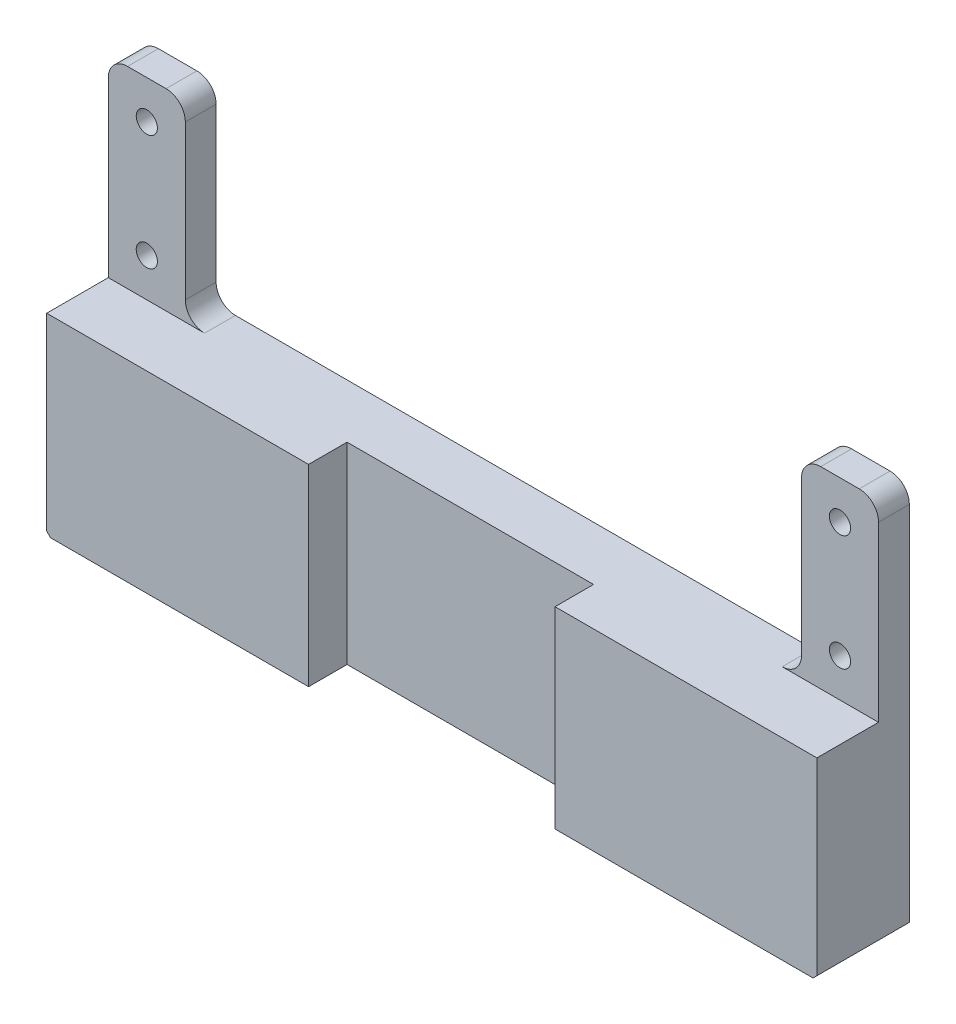
ISO-10303-21;
HEADER;
FILE_DESCRIPTION(('STEP AP214'),'2;1');
FILE_NAME('part.step','',(''),(''),'','','');
FILE_SCHEMA(('AUTOMOTIVE_DESIGN { 1 0 10303 214 1 1 1 1 }'));
ENDSEC;
DATA;
#1=APPLICATION_CONTEXT('core data for automotive mechanical design processes');
#2=APPLICATION_PROTOCOL_DEFINITION('international standard','automotive_design',2000,#1);
#3=PRODUCT_CONTEXT('',#1,'mechanical');
#4=PRODUCT('Part','Part','',(#3));
#5=PRODUCT_RELATED_PRODUCT_CATEGORY('part','',(#4));
#6=PRODUCT_DEFINITION_FORMATION('','',#4);
#7=PRODUCT_DEFINITION_CONTEXT('part definition',#1,'design');
#8=PRODUCT_DEFINITION('design','',#6,#7);
#9=PRODUCT_DEFINITION_SHAPE('','',#8);
#10=(LENGTH_UNIT() NAMED_UNIT(*) SI_UNIT(.MILLI.,.METRE.));
#11=(NAMED_UNIT(*) PLANE_ANGLE_UNIT() SI_UNIT($,.RADIAN.));
#12=(NAMED_UNIT(*) SI_UNIT($,.STERADIAN.) SOLID_ANGLE_UNIT());
#13=UNCERTAINTY_MEASURE_WITH_UNIT(LENGTH_MEASURE(1.E-05),#10,'distance_accuracy_value','');
#14=(GEOMETRIC_REPRESENTATION_CONTEXT(3) GLOBAL_UNCERTAINTY_ASSIGNED_CONTEXT((#13)) GLOBAL_UNIT_ASSIGNED_CONTEXT((#10,
#11,#12)) REPRESENTATION_CONTEXT('',''));
#15=CARTESIAN_POINT('',(0.,0.,0.));
#16=DIRECTION('',(0.,0.,1.));
#17=DIRECTION('',(1.,0.,0.));
#18=AXIS2_PLACEMENT_3D('',#15,#16,#17);
#19=CARTESIAN_POINT('',(0.,0.,0.));
#20=DIRECTION('',(0.,-1.,0.));
#21=DIRECTION('',(0.,0.,-1.));
#22=AXIS2_PLACEMENT_3D('',#19,#20,#21);
#23=PLANE('',#22);
#24=DIRECTION('',(1.,0.,0.));
#25=VECTOR('',#24,1.);
#26=CARTESIAN_POINT('',(100.,0.,0.));
#27=LINE('',#26,#25);
#28=CARTESIAN_POINT('',(75.,0.,0.));
#29=VERTEX_POINT('',#28);
#30=CARTESIAN_POINT('',(100.,0.,0.));
#31=VERTEX_POINT('',#30);
#32=EDGE_CURVE('E441',#29,#31,#27,.T.);
#33=ORIENTED_EDGE('',*,*,#32,.F.);
#34=DIRECTION('',(0.,0.,1.));
#35=VECTOR('',#34,1.);
#36=CARTESIAN_POINT('',(75.,0.,-8.));
#37=LINE('',#36,#35);
#38=CARTESIAN_POINT('',(75.,0.,-8.));
#39=VERTEX_POINT('',#38);
#40=EDGE_CURVE('E292',#29,#39,#37,.F.);
#41=ORIENTED_EDGE('',*,*,#40,.T.);
#42=DIRECTION('',(-1.,0.,0.));
#43=VECTOR('',#42,1.);
#44=CARTESIAN_POINT('',(-100.,0.,-8.));
#45=LINE('',#44,#43);
#46=CARTESIAN_POINT('',(-75.,0.,-8.));
#47=VERTEX_POINT('',#46);
#48=EDGE_CURVE('E197',#39,#47,#45,.T.);
#49=ORIENTED_EDGE('',*,*,#48,.T.);
#50=DIRECTION('',(0.,0.,-1.));
#51=VECTOR('',#50,1.);
#52=CARTESIAN_POINT('',(-75.,0.,0.));
#53=LINE('',#52,#51);
#54=CARTESIAN_POINT('',(-75.,0.,0.));
#55=VERTEX_POINT('',#54);
#56=EDGE_CURVE('E288',#47,#55,#53,.F.);
#57=ORIENTED_EDGE('',*,*,#56,.T.);
#58=DIRECTION('',(1.,0.,0.));
#59=VECTOR('',#58,1.);
#60=CARTESIAN_POINT('',(-100.,0.,0.));
#61=LINE('',#60,#59);
#62=CARTESIAN_POINT('',(-100.,0.,0.));
#63=VERTEX_POINT('',#62);
#64=EDGE_CURVE('E389',#63,#55,#61,.T.);
#65=ORIENTED_EDGE('',*,*,#64,.F.);
#66=DIRECTION('',(0.,0.,1.));
#67=VECTOR('',#66,1.);
#68=CARTESIAN_POINT('',(-100.,0.,16.));
#69=LINE('',#68,#67);
#70=CARTESIAN_POINT('',(-100.,0.,16.));
#71=VERTEX_POINT('',#70);
#72=EDGE_CURVE('E233',#63,#71,#69,.T.);
#73=ORIENTED_EDGE('',*,*,#72,.T.);
#74=DIRECTION('',(1.,0.,0.));
#75=VECTOR('',#74,1.);
#76=CARTESIAN_POINT('',(-32.,0.,16.));
#77=LINE('',#76,#75);
#78=CARTESIAN_POINT('',(-32.,0.,16.));
#79=VERTEX_POINT('',#78);
#80=EDGE_CURVE('E237',#71,#79,#77,.T.);
#81=ORIENTED_EDGE('',*,*,#80,.T.);
#82=DIRECTION('',(0.,0.,-1.));
#83=VECTOR('',#82,1.);
#84=CARTESIAN_POINT('',(-32.,0.,6.00000000000002));
#85=LINE('',#84,#83);
#86=CARTESIAN_POINT('',(-32.,0.,6.00000000000002));
#87=VERTEX_POINT('',#86);
#88=EDGE_CURVE('E203',#79,#87,#85,.T.);
#89=ORIENTED_EDGE('',*,*,#88,.T.);
#90=DIRECTION('',(1.,0.,0.));
#91=VECTOR('',#90,1.);
#92=CARTESIAN_POINT('',(32.,0.,6.00000000000002));
#93=LINE('',#92,#91);
#94=CARTESIAN_POINT('',(32.,0.,6.00000000000002));
#95=VERTEX_POINT('',#94);
#96=EDGE_CURVE('E243',#87,#95,#93,.T.);
#97=ORIENTED_EDGE('',*,*,#96,.T.);
#98=DIRECTION('',(0.,0.,1.));
#99=VECTOR('',#98,1.);
#100=CARTESIAN_POINT('',(32.,0.,16.));
#101=LINE('',#100,#99);
#102=CARTESIAN_POINT('',(32.,0.,16.));
#103=VERTEX_POINT('',#102);
#104=EDGE_CURVE('E247',#95,#103,#101,.T.);
#105=ORIENTED_EDGE('',*,*,#104,.T.);
#106=DIRECTION('',(1.,0.,0.));
#107=VECTOR('',#106,1.);
#108=CARTESIAN_POINT('',(100.,0.,16.));
#109=LINE('',#108,#107);
#110=CARTESIAN_POINT('',(100.,0.,16.));
#111=VERTEX_POINT('',#110);
#112=EDGE_CURVE('E251',#103,#111,#109,.T.);
#113=ORIENTED_EDGE('',*,*,#112,.T.);
#114=DIRECTION('',(0.,0.,-1.));
#115=VECTOR('',#114,1.);
#116=CARTESIAN_POINT('',(100.,0.,-8.));
#117=LINE('',#116,#115);
#118=EDGE_CURVE('E255',#111,#31,#117,.T.);
#119=ORIENTED_EDGE('',*,*,#118,.T.);
#120=EDGE_LOOP('',(#33,#41,#49,#57,#65,#73,#81,#89,#97,#105,#113,#119));
#121=FACE_BOUND('',#120,.T.);
#122=ADVANCED_FACE('F41',(#121),#23,.F.);
#123=CARTESIAN_POINT('',(-100.,-50.,16.));
#124=DIRECTION('',(-1.,0.,0.));
#125=DIRECTION('',(0.,0.,1.));
#126=AXIS2_PLACEMENT_3D('',#123,#124,#125);
#127=PLANE('',#126);
#128=DIRECTION('',(0.,1.,0.));
#129=VECTOR('',#128,1.);
#130=CARTESIAN_POINT('',(-100.,-50.,-8.));
#131=LINE('',#130,#129);
#132=CARTESIAN_POINT('',(-100.,-49.,-8.));
#133=VERTEX_POINT('',#132);
#134=CARTESIAN_POINT('',(-100.,45.,-8.));
#135=VERTEX_POINT('',#134);
#136=EDGE_CURVE('E262',#133,#135,#131,.T.);
#137=ORIENTED_EDGE('',*,*,#136,.F.);
#138=DIRECTION('',(0.,0.,1.));
#139=VECTOR('',#138,1.);
#140=CARTESIAN_POINT('',(-100.,-49.,16.));
#141=LINE('',#140,#139);
#142=CARTESIAN_POINT('',(-100.,-49.,16.));
#143=VERTEX_POINT('',#142);
#144=EDGE_CURVE('E51',#133,#143,#141,.T.);
#145=ORIENTED_EDGE('',*,*,#144,.T.);
#146=DIRECTION('',(0.,1.,0.));
#147=VECTOR('',#146,1.);
#148=CARTESIAN_POINT('',(-100.,-50.,16.));
#149=LINE('',#148,#147);
#150=EDGE_CURVE('E207',#143,#71,#149,.T.);
#151=ORIENTED_EDGE('',*,*,#150,.T.);
#152=ORIENTED_EDGE('',*,*,#72,.F.);
#153=DIRECTION('',(0.,-1.,0.));
#154=VECTOR('',#153,1.);
#155=CARTESIAN_POINT('',(-100.,50.,0.));
#156=LINE('',#155,#154);
#157=CARTESIAN_POINT('',(-100.,45.,0.));
#158=VERTEX_POINT('',#157);
#159=EDGE_CURVE('E238',#158,#63,#156,.T.);
#160=ORIENTED_EDGE('',*,*,#159,.F.);
#161=DIRECTION('',(0.,0.,1.));
#162=VECTOR('',#161,1.);
#163=CARTESIAN_POINT('',(-100.,45.,16.));
#164=LINE('',#163,#162);
#165=EDGE_CURVE('E346',#158,#135,#164,.F.);
#166=ORIENTED_EDGE('',*,*,#165,.T.);
#167=EDGE_LOOP('',(#137,#145,#151,#152,#160,#166));
#168=FACE_BOUND('',#167,.T.);
#169=ADVANCED_FACE('F384',(#168),#127,.T.);
#170=CARTESIAN_POINT('',(-100.,-50.,-8.));
#171=DIRECTION('',(0.,0.,-1.));
#172=DIRECTION('',(-1.,0.,0.));
#173=AXIS2_PLACEMENT_3D('',#170,#171,#172);
#174=PLANE('',#173);
#175=CARTESIAN_POINT('',(90.,40.,-8.));
#176=DIRECTION('',(0.,0.,-1.));
#177=DIRECTION('',(-1.,0.,0.));
#178=AXIS2_PLACEMENT_3D('',#175,#176,#177);
#179=CIRCLE('',#178,2.75);
#180=CARTESIAN_POINT('',(87.25,40.,-8.));
#181=VERTEX_POINT('',#180);
#182=EDGE_CURVE('E499',#181,#181,#179,.T.);
#183=ORIENTED_EDGE('',*,*,#182,.F.);
#184=EDGE_LOOP('',(#183));
#185=FACE_BOUND('',#184,.T.);
#186=CARTESIAN_POINT('',(-90.,10.,-8.));
#187=DIRECTION('',(0.,0.,-1.));
#188=DIRECTION('',(-1.,0.,0.));
#189=AXIS2_PLACEMENT_3D('',#186,#187,#188);
#190=CIRCLE('',#189,2.75);
#191=CARTESIAN_POINT('',(-92.75,10.,-8.));
#192=VERTEX_POINT('',#191);
#193=EDGE_CURVE('E491',#192,#192,#190,.T.);
#194=ORIENTED_EDGE('',*,*,#193,.F.);
#195=EDGE_LOOP('',(#194));
#196=FACE_BOUND('',#195,.T.);
#197=CARTESIAN_POINT('',(90.,10.,-8.));
#198=DIRECTION('',(0.,0.,-1.));
#199=DIRECTION('',(-1.,0.,0.));
#200=AXIS2_PLACEMENT_3D('',#197,#198,#199);
#201=CIRCLE('',#200,2.75);
#202=CARTESIAN_POINT('',(87.25,10.,-8.));
#203=VERTEX_POINT('',#202);
#204=EDGE_CURVE('E483',#203,#203,#201,.T.);
#205=ORIENTED_EDGE('',*,*,#204,.F.);
#206=EDGE_LOOP('',(#205));
#207=FACE_BOUND('',#206,.T.);
#208=CARTESIAN_POINT('',(-90.,40.,-8.));
#209=DIRECTION('',(0.,0.,-1.));
#210=DIRECTION('',(-1.,0.,0.));
#211=AXIS2_PLACEMENT_3D('',#208,#209,#210);
#212=CIRCLE('',#211,2.75);
#213=CARTESIAN_POINT('',(-92.75,40.,-8.));
#214=VERTEX_POINT('',#213);
#215=EDGE_CURVE('E475',#214,#214,#212,.T.);
#216=ORIENTED_EDGE('',*,*,#215,.F.);
#217=EDGE_LOOP('',(#216));
#218=FACE_BOUND('',#217,.T.);
#219=DIRECTION('',(0.,1.,0.));
#220=VECTOR('',#219,1.);
#221=CARTESIAN_POINT('',(100.,-50.,-8.));
#222=LINE('',#221,#220);
#223=CARTESIAN_POINT('',(100.,-49.,-8.));
#224=VERTEX_POINT('',#223);
#225=CARTESIAN_POINT('',(100.,45.,-8.));
#226=VERTEX_POINT('',#225);
#227=EDGE_CURVE('E266',#224,#226,#222,.T.);
#228=ORIENTED_EDGE('',*,*,#227,.F.);
#229=DIRECTION('',(0.707106781186557,0.707106781186538,0.));
#230=VECTOR('',#229,1.);
#231=CARTESIAN_POINT('',(-0.500000000002748,-149.5,-8.));
#232=LINE('',#231,#230);
#233=CARTESIAN_POINT('',(99.,-50.,-8.));
#234=VERTEX_POINT('',#233);
#235=EDGE_CURVE('E370',#224,#234,#232,.F.);
#236=ORIENTED_EDGE('',*,*,#235,.T.);
#237=DIRECTION('',(-1.,0.,0.));
#238=VECTOR('',#237,1.);
#239=CARTESIAN_POINT('',(-100.,-50.,-8.));
#240=LINE('',#239,#238);
#241=CARTESIAN_POINT('',(-99.,-50.,-8.));
#242=VERTEX_POINT('',#241);
#243=EDGE_CURVE('E229',#234,#242,#240,.T.);
#244=ORIENTED_EDGE('',*,*,#243,.T.);
#245=DIRECTION('',(0.707106781186557,-0.707106781186538,0.));
#246=VECTOR('',#245,1.);
#247=CARTESIAN_POINT('',(-99.5,-49.5,-8.));
#248=LINE('',#247,#246);
#249=EDGE_CURVE('E367',#242,#133,#248,.F.);
#250=ORIENTED_EDGE('',*,*,#249,.T.);
#251=ORIENTED_EDGE('',*,*,#136,.T.);
#252=CARTESIAN_POINT('',(-95.,45.,-8.));
#253=DIRECTION('',(0.,0.,-1.));
#254=DIRECTION('',(-1.,0.,0.));
#255=AXIS2_PLACEMENT_3D('',#252,#253,#254);
#256=CIRCLE('',#255,5.);
#257=CARTESIAN_POINT('',(-95.,50.,-8.));
#258=VERTEX_POINT('',#257);
#259=EDGE_CURVE('E310',#135,#258,#256,.T.);
#260=ORIENTED_EDGE('',*,*,#259,.T.);
#261=DIRECTION('',(-1.,0.,0.));
#262=VECTOR('',#261,1.);
#263=CARTESIAN_POINT('',(-100.,50.,-8.));
#264=LINE('',#263,#262);
#265=CARTESIAN_POINT('',(-85.,50.,-8.));
#266=VERTEX_POINT('',#265);
#267=EDGE_CURVE('E404',#266,#258,#264,.T.);
#268=ORIENTED_EDGE('',*,*,#267,.F.);
#269=CARTESIAN_POINT('',(-85.,45.,-8.));
#270=DIRECTION('',(0.,0.,-1.));
#271=DIRECTION('',(-1.,0.,0.));
#272=AXIS2_PLACEMENT_3D('',#269,#270,#271);
#273=CIRCLE('',#272,5.);
#274=CARTESIAN_POINT('',(-80.,45.,-8.));
#275=VERTEX_POINT('',#274);
#276=EDGE_CURVE('E313',#266,#275,#273,.T.);
#277=ORIENTED_EDGE('',*,*,#276,.T.);
#278=DIRECTION('',(0.,-1.,0.));
#279=VECTOR('',#278,1.);
#280=CARTESIAN_POINT('',(-80.,50.,-8.));
#281=LINE('',#280,#279);
#282=CARTESIAN_POINT('',(-80.,5.,-8.));
#283=VERTEX_POINT('',#282);
#284=EDGE_CURVE('E411',#275,#283,#281,.T.);
#285=ORIENTED_EDGE('',*,*,#284,.T.);
#286=CARTESIAN_POINT('',(-75.,5.,-8.));
#287=DIRECTION('',(0.,0.,-1.));
#288=DIRECTION('',(-1.,0.,0.));
#289=AXIS2_PLACEMENT_3D('',#286,#287,#288);
#290=CIRCLE('',#289,5.);
#291=EDGE_CURVE('E357',#283,#47,#290,.F.);
#292=ORIENTED_EDGE('',*,*,#291,.T.);
#293=ORIENTED_EDGE('',*,*,#48,.F.);
#294=CARTESIAN_POINT('',(75.,5.,-8.));
#295=DIRECTION('',(0.,0.,-1.));
#296=DIRECTION('',(-1.,0.,0.));
#297=AXIS2_PLACEMENT_3D('',#294,#295,#296);
#298=CIRCLE('',#297,5.);
#299=CARTESIAN_POINT('',(80.,5.,-8.));
#300=VERTEX_POINT('',#299);
#301=EDGE_CURVE('E354',#39,#300,#298,.F.);
#302=ORIENTED_EDGE('',*,*,#301,.T.);
#303=DIRECTION('',(0.,-1.,0.));
#304=VECTOR('',#303,1.);
#305=CARTESIAN_POINT('',(80.,50.,-8.));
#306=LINE('',#305,#304);
#307=CARTESIAN_POINT('',(80.,45.,-8.));
#308=VERTEX_POINT('',#307);
#309=EDGE_CURVE('E422',#308,#300,#306,.T.);
#310=ORIENTED_EDGE('',*,*,#309,.F.);
#311=CARTESIAN_POINT('',(85.,45.,-8.));
#312=DIRECTION('',(0.,0.,-1.));
#313=DIRECTION('',(-1.,0.,0.));
#314=AXIS2_PLACEMENT_3D('',#311,#312,#313);
#315=CIRCLE('',#314,5.);
#316=CARTESIAN_POINT('',(85.,50.,-8.));
#317=VERTEX_POINT('',#316);
#318=EDGE_CURVE('E316',#308,#317,#315,.T.);
#319=ORIENTED_EDGE('',*,*,#318,.T.);
#320=DIRECTION('',(-1.,0.,0.));
#321=VECTOR('',#320,1.);
#322=CARTESIAN_POINT('',(100.,50.,-8.));
#323=LINE('',#322,#321);
#324=CARTESIAN_POINT('',(95.,50.,-8.));
#325=VERTEX_POINT('',#324);
#326=EDGE_CURVE('E464',#325,#317,#323,.T.);
#327=ORIENTED_EDGE('',*,*,#326,.F.);
#328=CARTESIAN_POINT('',(95.,45.,-8.));
#329=DIRECTION('',(0.,0.,-1.));
#330=DIRECTION('',(-1.,0.,0.));
#331=AXIS2_PLACEMENT_3D('',#328,#329,#330);
#332=CIRCLE('',#331,5.);
#333=EDGE_CURVE('E319',#325,#226,#332,.T.);
#334=ORIENTED_EDGE('',*,*,#333,.T.);
#335=EDGE_LOOP('',(#228,#236,#244,#250,#251,#260,#268,#277,#285,#292,#293,#302,#310,#319,#327,#334));
#336=FACE_BOUND('',#335,.T.);
#337=ADVANCED_FACE('F403',(#185,#196,#207,#218,#336),#174,.T.);
#338=CARTESIAN_POINT('',(100.,-50.,-8.));
#339=DIRECTION('',(1.,0.,0.));
#340=DIRECTION('',(0.,0.,-1.));
#341=AXIS2_PLACEMENT_3D('',#338,#339,#340);
#342=PLANE('',#341);
#343=DIRECTION('',(0.,1.,0.));
#344=VECTOR('',#343,1.);
#345=CARTESIAN_POINT('',(100.,-50.,16.));
#346=LINE('',#345,#344);
#347=CARTESIAN_POINT('',(100.,-49.,16.));
#348=VERTEX_POINT('',#347);
#349=EDGE_CURVE('E269',#348,#111,#346,.T.);
#350=ORIENTED_EDGE('',*,*,#349,.F.);
#351=DIRECTION('',(0.,0.,-1.));
#352=VECTOR('',#351,1.);
#353=CARTESIAN_POINT('',(100.,-49.,-8.));
#354=LINE('',#353,#352);
#355=EDGE_CURVE('E363',#348,#224,#354,.T.);
#356=ORIENTED_EDGE('',*,*,#355,.T.);
#357=ORIENTED_EDGE('',*,*,#227,.T.);
#358=DIRECTION('',(0.,0.,-1.));
#359=VECTOR('',#358,1.);
#360=CARTESIAN_POINT('',(100.,45.,0.));
#361=LINE('',#360,#359);
#362=CARTESIAN_POINT('',(100.,45.,0.));
#363=VERTEX_POINT('',#362);
#364=EDGE_CURVE('E323',#226,#363,#361,.F.);
#365=ORIENTED_EDGE('',*,*,#364,.T.);
#366=DIRECTION('',(0.,-1.,0.));
#367=VECTOR('',#366,1.);
#368=CARTESIAN_POINT('',(100.,50.,0.));
#369=LINE('',#368,#367);
#370=EDGE_CURVE('E456',#363,#31,#369,.T.);
#371=ORIENTED_EDGE('',*,*,#370,.T.);
#372=ORIENTED_EDGE('',*,*,#118,.F.);
#373=EDGE_LOOP('',(#350,#356,#357,#365,#371,#372));
#374=FACE_BOUND('',#373,.T.);
#375=ADVANCED_FACE('F508',(#374),#342,.T.);
#376=CARTESIAN_POINT('',(100.,-50.,16.));
#377=DIRECTION('',(0.,0.,1.));
#378=DIRECTION('',(1.,0.,0.));
#379=AXIS2_PLACEMENT_3D('',#376,#377,#378);
#380=PLANE('',#379);
#381=DIRECTION('',(1.,0.,0.));
#382=VECTOR('',#381,1.);
#383=CARTESIAN_POINT('',(100.,-50.,16.));
#384=LINE('',#383,#382);
#385=CARTESIAN_POINT('',(32.,-50.,16.));
#386=VERTEX_POINT('',#385);
#387=CARTESIAN_POINT('',(99.,-50.,16.));
#388=VERTEX_POINT('',#387);
#389=EDGE_CURVE('E225',#386,#388,#384,.T.);
#390=ORIENTED_EDGE('',*,*,#389,.T.);
#391=DIRECTION('',(-0.707106781186557,-0.707106781186538,0.));
#392=VECTOR('',#391,1.);
#393=CARTESIAN_POINT('',(99.5,-49.5,16.));
#394=LINE('',#393,#392);
#395=EDGE_CURVE('E379',#388,#348,#394,.F.);
#396=ORIENTED_EDGE('',*,*,#395,.T.);
#397=ORIENTED_EDGE('',*,*,#349,.T.);
#398=ORIENTED_EDGE('',*,*,#112,.F.);
#399=DIRECTION('',(0.,1.,0.));
#400=VECTOR('',#399,1.);
#401=CARTESIAN_POINT('',(32.,-50.,16.));
#402=LINE('',#401,#400);
#403=EDGE_CURVE('E272',#386,#103,#402,.T.);
#404=ORIENTED_EDGE('',*,*,#403,.F.);
#405=EDGE_LOOP('',(#390,#396,#397,#398,#404));
#406=FACE_BOUND('',#405,.T.);
#407=ADVANCED_FACE('F544',(#406),#380,.T.);
#408=CARTESIAN_POINT('',(32.,-50.,16.));
#409=DIRECTION('',(-1.,0.,0.));
#410=DIRECTION('',(0.,0.,1.));
#411=AXIS2_PLACEMENT_3D('',#408,#409,#410);
#412=PLANE('',#411);
#413=ORIENTED_EDGE('',*,*,#104,.F.);
#414=DIRECTION('',(0.,1.,0.));
#415=VECTOR('',#414,1.);
#416=CARTESIAN_POINT('',(32.,-50.,6.00000000000002));
#417=LINE('',#416,#415);
#418=CARTESIAN_POINT('',(32.,-50.,6.00000000000002));
#419=VERTEX_POINT('',#418);
#420=EDGE_CURVE('E275',#419,#95,#417,.T.);
#421=ORIENTED_EDGE('',*,*,#420,.F.);
#422=DIRECTION('',(0.,0.,1.));
#423=VECTOR('',#422,1.);
#424=CARTESIAN_POINT('',(32.,-50.,16.));
#425=LINE('',#424,#423);
#426=EDGE_CURVE('E218',#419,#386,#425,.T.);
#427=ORIENTED_EDGE('',*,*,#426,.T.);
#428=ORIENTED_EDGE('',*,*,#403,.T.);
#429=EDGE_LOOP('',(#413,#421,#427,#428));
#430=FACE_BOUND('',#429,.T.);
#431=ADVANCED_FACE('F548',(#430),#412,.T.);
#432=CARTESIAN_POINT('',(32.,-50.,6.00000000000002));
#433=DIRECTION('',(0.,0.,1.));
#434=DIRECTION('',(1.,0.,0.));
#435=AXIS2_PLACEMENT_3D('',#432,#433,#434);
#436=PLANE('',#435);
#437=ORIENTED_EDGE('',*,*,#96,.F.);
#438=DIRECTION('',(0.,1.,0.));
#439=VECTOR('',#438,1.);
#440=CARTESIAN_POINT('',(-32.,-50.,6.00000000000002));
#441=LINE('',#440,#439);
#442=CARTESIAN_POINT('',(-32.,-50.,6.00000000000002));
#443=VERTEX_POINT('',#442);
#444=EDGE_CURVE('E206',#443,#87,#441,.T.);
#445=ORIENTED_EDGE('',*,*,#444,.F.);
#446=DIRECTION('',(1.,0.,0.));
#447=VECTOR('',#446,1.);
#448=CARTESIAN_POINT('',(32.,-50.,6.00000000000002));
#449=LINE('',#448,#447);
#450=EDGE_CURVE('E214',#443,#419,#449,.T.);
#451=ORIENTED_EDGE('',*,*,#450,.T.);
#452=ORIENTED_EDGE('',*,*,#420,.T.);
#453=EDGE_LOOP('',(#437,#445,#451,#452));
#454=FACE_BOUND('',#453,.T.);
#455=ADVANCED_FACE('F552',(#454),#436,.T.);
#456=CARTESIAN_POINT('',(-32.,-50.,6.00000000000002));
#457=DIRECTION('',(1.,0.,0.));
#458=DIRECTION('',(0.,0.,-1.));
#459=AXIS2_PLACEMENT_3D('',#456,#457,#458);
#460=PLANE('',#459);
#461=ORIENTED_EDGE('',*,*,#88,.F.);
#462=DIRECTION('',(0.,1.,0.));
#463=VECTOR('',#462,1.);
#464=CARTESIAN_POINT('',(-32.,-50.,16.));
#465=LINE('',#464,#463);
#466=CARTESIAN_POINT('',(-32.,-50.,16.));
#467=VERTEX_POINT('',#466);
#468=EDGE_CURVE('E191',#467,#79,#465,.T.);
#469=ORIENTED_EDGE('',*,*,#468,.F.);
#470=DIRECTION('',(0.,0.,-1.));
#471=VECTOR('',#470,1.);
#472=CARTESIAN_POINT('',(-32.,-50.,6.00000000000002));
#473=LINE('',#472,#471);
#474=EDGE_CURVE('E196',#467,#443,#473,.T.);
#475=ORIENTED_EDGE('',*,*,#474,.T.);
#476=ORIENTED_EDGE('',*,*,#444,.T.);
#477=EDGE_LOOP('',(#461,#469,#475,#476));
#478=FACE_BOUND('',#477,.T.);
#479=ADVANCED_FACE('F201',(#478),#460,.T.);
#480=CARTESIAN_POINT('',(-32.,-50.,16.));
#481=DIRECTION('',(0.,0.,1.));
#482=DIRECTION('',(1.,0.,0.));
#483=AXIS2_PLACEMENT_3D('',#480,#481,#482);
#484=PLANE('',#483);
#485=ORIENTED_EDGE('',*,*,#150,.F.);
#486=DIRECTION('',(-0.707106781186557,0.707106781186538,0.));
#487=VECTOR('',#486,1.);
#488=CARTESIAN_POINT('',(-65.4999999999991,-83.5,16.));
#489=LINE('',#488,#487);
#490=CARTESIAN_POINT('',(-99.,-50.,16.));
#491=VERTEX_POINT('',#490);
#492=EDGE_CURVE('E11',#143,#491,#489,.F.);
#493=ORIENTED_EDGE('',*,*,#492,.T.);
#494=DIRECTION('',(1.,0.,0.));
#495=VECTOR('',#494,1.);
#496=CARTESIAN_POINT('',(-32.,-50.,16.));
#497=LINE('',#496,#495);
#498=EDGE_CURVE('E187',#491,#467,#497,.T.);
#499=ORIENTED_EDGE('',*,*,#498,.T.);
#500=ORIENTED_EDGE('',*,*,#468,.T.);
#501=ORIENTED_EDGE('',*,*,#80,.F.);
#502=EDGE_LOOP('',(#485,#493,#499,#500,#501));
#503=FACE_BOUND('',#502,.T.);
#504=ADVANCED_FACE('F189',(#503),#484,.T.);
#505=CARTESIAN_POINT('',(0.,-50.,0.));
#506=DIRECTION('',(0.,-1.,0.));
#507=DIRECTION('',(0.,0.,-1.));
#508=AXIS2_PLACEMENT_3D('',#505,#506,#507);
#509=PLANE('',#508);
#510=ORIENTED_EDGE('',*,*,#243,.F.);
#511=DIRECTION('',(0.,0.,1.));
#512=VECTOR('',#511,1.);
#513=CARTESIAN_POINT('',(99.,-50.,0.));
#514=LINE('',#513,#512);
#515=EDGE_CURVE('E376',#234,#388,#514,.T.);
#516=ORIENTED_EDGE('',*,*,#515,.T.);
#517=ORIENTED_EDGE('',*,*,#389,.F.);
#518=ORIENTED_EDGE('',*,*,#426,.F.);
#519=ORIENTED_EDGE('',*,*,#450,.F.);
#520=ORIENTED_EDGE('',*,*,#474,.F.);
#521=ORIENTED_EDGE('',*,*,#498,.F.);
#522=DIRECTION('',(0.,0.,-1.));
#523=VECTOR('',#522,1.);
#524=CARTESIAN_POINT('',(-99.,-50.,0.));
#525=LINE('',#524,#523);
#526=EDGE_CURVE('E373',#491,#242,#525,.T.);
#527=ORIENTED_EDGE('',*,*,#526,.T.);
#528=EDGE_LOOP('',(#510,#516,#517,#518,#519,#520,#521,#527));
#529=FACE_BOUND('',#528,.T.);
#530=ADVANCED_FACE('F211',(#529),#509,.T.);
#531=CARTESIAN_POINT('',(-100.,50.,0.));
#532=DIRECTION('',(0.,0.,-1.));
#533=DIRECTION('',(-1.,0.,0.));
#534=AXIS2_PLACEMENT_3D('',#531,#532,#533);
#535=PLANE('',#534);
#536=CARTESIAN_POINT('',(-90.,10.,0.));
#537=DIRECTION('',(0.,0.,-1.));
#538=DIRECTION('',(-1.,0.,0.));
#539=AXIS2_PLACEMENT_3D('',#536,#537,#538);
#540=CIRCLE('',#539,2.75);
#541=CARTESIAN_POINT('',(-92.75,10.,0.));
#542=VERTEX_POINT('',#541);
#543=EDGE_CURVE('E487',#542,#542,#540,.T.);
#544=ORIENTED_EDGE('',*,*,#543,.T.);
#545=EDGE_LOOP('',(#544));
#546=FACE_BOUND('',#545,.T.);
#547=CARTESIAN_POINT('',(-90.,40.,0.));
#548=DIRECTION('',(0.,0.,-1.));
#549=DIRECTION('',(-1.,0.,0.));
#550=AXIS2_PLACEMENT_3D('',#547,#548,#549);
#551=CIRCLE('',#550,2.75);
#552=CARTESIAN_POINT('',(-92.75,40.,0.));
#553=VERTEX_POINT('',#552);
#554=EDGE_CURVE('E465',#553,#553,#551,.T.);
#555=ORIENTED_EDGE('',*,*,#554,.T.);
#556=EDGE_LOOP('',(#555));
#557=FACE_BOUND('',#556,.T.);
#558=DIRECTION('',(0.,-1.,0.));
#559=VECTOR('',#558,1.);
#560=CARTESIAN_POINT('',(-80.,50.,0.));
#561=LINE('',#560,#559);
#562=CARTESIAN_POINT('',(-80.,45.,0.));
#563=VERTEX_POINT('',#562);
#564=CARTESIAN_POINT('',(-80.,5.,0.));
#565=VERTEX_POINT('',#564);
#566=EDGE_CURVE('E395',#563,#565,#561,.T.);
#567=ORIENTED_EDGE('',*,*,#566,.F.);
#568=CARTESIAN_POINT('',(-85.,45.,0.));
#569=DIRECTION('',(0.,0.,-1.));
#570=DIRECTION('',(-1.,0.,0.));
#571=AXIS2_PLACEMENT_3D('',#568,#569,#570);
#572=CIRCLE('',#571,5.);
#573=CARTESIAN_POINT('',(-85.,50.,0.));
#574=VERTEX_POINT('',#573);
#575=EDGE_CURVE('E343',#563,#574,#572,.F.);
#576=ORIENTED_EDGE('',*,*,#575,.T.);
#577=DIRECTION('',(1.,0.,0.));
#578=VECTOR('',#577,1.);
#579=CARTESIAN_POINT('',(-100.,50.,0.));
#580=LINE('',#579,#578);
#581=CARTESIAN_POINT('',(-95.,50.,0.));
#582=VERTEX_POINT('',#581);
#583=EDGE_CURVE('E412',#582,#574,#580,.T.);
#584=ORIENTED_EDGE('',*,*,#583,.F.);
#585=CARTESIAN_POINT('',(-95.,45.,0.));
#586=DIRECTION('',(0.,0.,-1.));
#587=DIRECTION('',(-1.,0.,0.));
#588=AXIS2_PLACEMENT_3D('',#585,#586,#587);
#589=CIRCLE('',#588,5.);
#590=EDGE_CURVE('E340',#582,#158,#589,.F.);
#591=ORIENTED_EDGE('',*,*,#590,.T.);
#592=ORIENTED_EDGE('',*,*,#159,.T.);
#593=ORIENTED_EDGE('',*,*,#64,.T.);
#594=CARTESIAN_POINT('',(-75.,5.,0.));
#595=DIRECTION('',(0.,0.,-1.));
#596=DIRECTION('',(-1.,0.,0.));
#597=AXIS2_PLACEMENT_3D('',#594,#595,#596);
#598=CIRCLE('',#597,5.);
#599=EDGE_CURVE('E360',#55,#565,#598,.T.);
#600=ORIENTED_EDGE('',*,*,#599,.T.);
#601=EDGE_LOOP('',(#567,#576,#584,#591,#592,#593,#600));
#602=FACE_BOUND('',#601,.T.);
#603=ADVANCED_FACE('F616',(#546,#557,#602),#535,.F.);
#604=CARTESIAN_POINT('',(-80.,50.,-8.));
#605=DIRECTION('',(-1.,0.,0.));
#606=DIRECTION('',(0.,0.,1.));
#607=AXIS2_PLACEMENT_3D('',#604,#605,#606);
#608=PLANE('',#607);
#609=ORIENTED_EDGE('',*,*,#566,.T.);
#610=DIRECTION('',(0.,0.,-1.));
#611=VECTOR('',#610,1.);
#612=CARTESIAN_POINT('',(-80.,5.,-8.));
#613=LINE('',#612,#611);
#614=EDGE_CURVE('E298',#565,#283,#613,.T.);
#615=ORIENTED_EDGE('',*,*,#614,.T.);
#616=ORIENTED_EDGE('',*,*,#284,.F.);
#617=DIRECTION('',(0.,0.,-1.));
#618=VECTOR('',#617,1.);
#619=CARTESIAN_POINT('',(-80.,45.,0.));
#620=LINE('',#619,#618);
#621=EDGE_CURVE('E295',#275,#563,#620,.F.);
#622=ORIENTED_EDGE('',*,*,#621,.T.);
#623=EDGE_LOOP('',(#609,#615,#616,#622));
#624=FACE_BOUND('',#623,.T.);
#625=ADVANCED_FACE('F429',(#624),#608,.F.);
#626=CARTESIAN_POINT('',(0.,50.,0.));
#627=DIRECTION('',(0.,1.,0.));
#628=DIRECTION('',(0.,0.,1.));
#629=AXIS2_PLACEMENT_3D('',#626,#627,#628);
#630=PLANE('',#629);
#631=ORIENTED_EDGE('',*,*,#583,.T.);
#632=DIRECTION('',(0.,0.,-1.));
#633=VECTOR('',#632,1.);
#634=CARTESIAN_POINT('',(-85.,50.,-8.));
#635=LINE('',#634,#633);
#636=EDGE_CURVE('E336',#574,#266,#635,.T.);
#637=ORIENTED_EDGE('',*,*,#636,.T.);
#638=ORIENTED_EDGE('',*,*,#267,.T.);
#639=DIRECTION('',(0.,0.,1.));
#640=VECTOR('',#639,1.);
#641=CARTESIAN_POINT('',(-95.,50.,0.));
#642=LINE('',#641,#640);
#643=EDGE_CURVE('E332',#258,#582,#642,.T.);
#644=ORIENTED_EDGE('',*,*,#643,.T.);
#645=EDGE_LOOP('',(#631,#637,#638,#644));
#646=FACE_BOUND('',#645,.T.);
#647=ADVANCED_FACE('F407',(#646),#630,.T.);
#648=CARTESIAN_POINT('',(80.,50.,-8.));
#649=DIRECTION('',(1.,0.,0.));
#650=DIRECTION('',(0.,0.,-1.));
#651=AXIS2_PLACEMENT_3D('',#648,#649,#650);
#652=PLANE('',#651);
#653=ORIENTED_EDGE('',*,*,#309,.T.);
#654=DIRECTION('',(0.,0.,1.));
#655=VECTOR('',#654,1.);
#656=CARTESIAN_POINT('',(80.,5.,0.));
#657=LINE('',#656,#655);
#658=CARTESIAN_POINT('',(80.,5.,0.));
#659=VERTEX_POINT('',#658);
#660=EDGE_CURVE('E284',#300,#659,#657,.T.);
#661=ORIENTED_EDGE('',*,*,#660,.T.);
#662=DIRECTION('',(0.,-1.,0.));
#663=VECTOR('',#662,1.);
#664=CARTESIAN_POINT('',(80.,50.,0.));
#665=LINE('',#664,#663);
#666=CARTESIAN_POINT('',(80.,45.,0.));
#667=VERTEX_POINT('',#666);
#668=EDGE_CURVE('E454',#667,#659,#665,.T.);
#669=ORIENTED_EDGE('',*,*,#668,.F.);
#670=DIRECTION('',(0.,0.,1.));
#671=VECTOR('',#670,1.);
#672=CARTESIAN_POINT('',(80.,45.,-8.));
#673=LINE('',#672,#671);
#674=EDGE_CURVE('E265',#667,#308,#673,.F.);
#675=ORIENTED_EDGE('',*,*,#674,.T.);
#676=EDGE_LOOP('',(#653,#661,#669,#675));
#677=FACE_BOUND('',#676,.T.);
#678=ADVANCED_FACE('F449',(#677),#652,.F.);
#679=CARTESIAN_POINT('',(100.,50.,0.));
#680=DIRECTION('',(0.,0.,-1.));
#681=DIRECTION('',(-1.,0.,0.));
#682=AXIS2_PLACEMENT_3D('',#679,#680,#681);
#683=PLANE('',#682);
#684=CARTESIAN_POINT('',(90.,40.,0.));
#685=DIRECTION('',(0.,0.,-1.));
#686=DIRECTION('',(-1.,0.,0.));
#687=AXIS2_PLACEMENT_3D('',#684,#685,#686);
#688=CIRCLE('',#687,2.75);
#689=CARTESIAN_POINT('',(87.25,40.,0.));
#690=VERTEX_POINT('',#689);
#691=EDGE_CURVE('E495',#690,#690,#688,.T.);
#692=ORIENTED_EDGE('',*,*,#691,.T.);
#693=EDGE_LOOP('',(#692));
#694=FACE_BOUND('',#693,.T.);
#695=CARTESIAN_POINT('',(90.,10.,0.));
#696=DIRECTION('',(0.,0.,-1.));
#697=DIRECTION('',(-1.,0.,0.));
#698=AXIS2_PLACEMENT_3D('',#695,#696,#697);
#699=CIRCLE('',#698,2.75);
#700=CARTESIAN_POINT('',(87.25,10.,0.));
#701=VERTEX_POINT('',#700);
#702=EDGE_CURVE('E479',#701,#701,#699,.T.);
#703=ORIENTED_EDGE('',*,*,#702,.T.);
#704=EDGE_LOOP('',(#703));
#705=FACE_BOUND('',#704,.T.);
#706=ORIENTED_EDGE('',*,*,#370,.F.);
#707=CARTESIAN_POINT('',(95.,45.,0.));
#708=DIRECTION('',(0.,0.,-1.));
#709=DIRECTION('',(-1.,0.,0.));
#710=AXIS2_PLACEMENT_3D('',#707,#708,#709);
#711=CIRCLE('',#710,5.);
#712=CARTESIAN_POINT('',(95.,50.,0.));
#713=VERTEX_POINT('',#712);
#714=EDGE_CURVE('E329',#363,#713,#711,.F.);
#715=ORIENTED_EDGE('',*,*,#714,.T.);
#716=DIRECTION('',(1.,0.,0.));
#717=VECTOR('',#716,1.);
#718=CARTESIAN_POINT('',(100.,50.,0.));
#719=LINE('',#718,#717);
#720=CARTESIAN_POINT('',(85.,50.,0.));
#721=VERTEX_POINT('',#720);
#722=EDGE_CURVE('E461',#721,#713,#719,.T.);
#723=ORIENTED_EDGE('',*,*,#722,.F.);
#724=CARTESIAN_POINT('',(85.,45.,0.));
#725=DIRECTION('',(0.,0.,-1.));
#726=DIRECTION('',(-1.,0.,0.));
#727=AXIS2_PLACEMENT_3D('',#724,#725,#726);
#728=CIRCLE('',#727,5.);
#729=EDGE_CURVE('E326',#721,#667,#728,.F.);
#730=ORIENTED_EDGE('',*,*,#729,.T.);
#731=ORIENTED_EDGE('',*,*,#668,.T.);
#732=CARTESIAN_POINT('',(75.,5.,0.));
#733=DIRECTION('',(0.,0.,-1.));
#734=DIRECTION('',(-1.,0.,0.));
#735=AXIS2_PLACEMENT_3D('',#732,#733,#734);
#736=CIRCLE('',#735,5.);
#737=EDGE_CURVE('E350',#659,#29,#736,.T.);
#738=ORIENTED_EDGE('',*,*,#737,.T.);
#739=ORIENTED_EDGE('',*,*,#32,.T.);
#740=EDGE_LOOP('',(#706,#715,#723,#730,#731,#738,#739));
#741=FACE_BOUND('',#740,.T.);
#742=ADVANCED_FACE('F529',(#694,#705,#741),#683,.F.);
#743=CARTESIAN_POINT('',(0.,50.,0.));
#744=DIRECTION('',(0.,-1.,0.));
#745=DIRECTION('',(0.,0.,-1.));
#746=AXIS2_PLACEMENT_3D('',#743,#744,#745);
#747=PLANE('',#746);
#748=ORIENTED_EDGE('',*,*,#722,.T.);
#749=DIRECTION('',(0.,0.,-1.));
#750=VECTOR('',#749,1.);
#751=CARTESIAN_POINT('',(95.,50.,-8.));
#752=LINE('',#751,#750);
#753=EDGE_CURVE('E306',#713,#325,#752,.T.);
#754=ORIENTED_EDGE('',*,*,#753,.T.);
#755=ORIENTED_EDGE('',*,*,#326,.T.);
#756=DIRECTION('',(0.,0.,1.));
#757=VECTOR('',#756,1.);
#758=CARTESIAN_POINT('',(85.,50.,0.));
#759=LINE('',#758,#757);
#760=EDGE_CURVE('E302',#317,#721,#759,.T.);
#761=ORIENTED_EDGE('',*,*,#760,.T.);
#762=EDGE_LOOP('',(#748,#754,#755,#761));
#763=FACE_BOUND('',#762,.T.);
#764=ADVANCED_FACE('F519',(#763),#747,.F.);
#765=CARTESIAN_POINT('',(-90.,40.,-8.));
#766=DIRECTION('',(0.,0.,-1.));
#767=DIRECTION('',(-1.,0.,0.));
#768=AXIS2_PLACEMENT_3D('',#765,#766,#767);
#769=CYLINDRICAL_SURFACE('',#768,2.75);
#770=ORIENTED_EDGE('',*,*,#554,.F.);
#771=EDGE_LOOP('',(#770));
#772=FACE_BOUND('',#771,.T.);
#773=ORIENTED_EDGE('',*,*,#215,.T.);
#774=EDGE_LOOP('',(#773));
#775=FACE_BOUND('',#774,.T.);
#776=ADVANCED_FACE('F516',(#772,#775),#769,.F.);
#777=CARTESIAN_POINT('',(90.,10.,-8.));
#778=DIRECTION('',(0.,0.,-1.));
#779=DIRECTION('',(-1.,0.,0.));
#780=AXIS2_PLACEMENT_3D('',#777,#778,#779);
#781=CYLINDRICAL_SURFACE('',#780,2.75);
#782=ORIENTED_EDGE('',*,*,#702,.F.);
#783=EDGE_LOOP('',(#782));
#784=FACE_BOUND('',#783,.T.);
#785=ORIENTED_EDGE('',*,*,#204,.T.);
#786=EDGE_LOOP('',(#785));
#787=FACE_BOUND('',#786,.T.);
#788=ADVANCED_FACE('F518',(#784,#787),#781,.F.);
#789=CARTESIAN_POINT('',(-90.,10.,-8.));
#790=DIRECTION('',(0.,0.,-1.));
#791=DIRECTION('',(-1.,0.,0.));
#792=AXIS2_PLACEMENT_3D('',#789,#790,#791);
#793=CYLINDRICAL_SURFACE('',#792,2.75);
#794=ORIENTED_EDGE('',*,*,#543,.F.);
#795=EDGE_LOOP('',(#794));
#796=FACE_BOUND('',#795,.T.);
#797=ORIENTED_EDGE('',*,*,#193,.T.);
#798=EDGE_LOOP('',(#797));
#799=FACE_BOUND('',#798,.T.);
#800=ADVANCED_FACE('F526',(#796,#799),#793,.F.);
#801=CARTESIAN_POINT('',(90.,40.,-8.));
#802=DIRECTION('',(0.,0.,-1.));
#803=DIRECTION('',(-1.,0.,0.));
#804=AXIS2_PLACEMENT_3D('',#801,#802,#803);
#805=CYLINDRICAL_SURFACE('',#804,2.75);
#806=ORIENTED_EDGE('',*,*,#691,.F.);
#807=EDGE_LOOP('',(#806));
#808=FACE_BOUND('',#807,.T.);
#809=ORIENTED_EDGE('',*,*,#182,.T.);
#810=EDGE_LOOP('',(#809));
#811=FACE_BOUND('',#810,.T.);
#812=ADVANCED_FACE('F504',(#808,#811),#805,.F.);
#813=CARTESIAN_POINT('',(75.,5.,-8.));
#814=DIRECTION('',(0.,0.,-1.));
#815=DIRECTION('',(-1.,0.,0.));
#816=AXIS2_PLACEMENT_3D('',#813,#814,#815);
#817=CYLINDRICAL_SURFACE('',#816,5.);
#818=ORIENTED_EDGE('',*,*,#301,.F.);
#819=ORIENTED_EDGE('',*,*,#40,.F.);
#820=ORIENTED_EDGE('',*,*,#737,.F.);
#821=ORIENTED_EDGE('',*,*,#660,.F.);
#822=EDGE_LOOP('',(#818,#819,#820,#821));
#823=FACE_BOUND('',#822,.T.);
#824=ADVANCED_FACE('F443',(#823),#817,.F.);
#825=CARTESIAN_POINT('',(-75.,5.,-8.));
#826=DIRECTION('',(0.,0.,1.));
#827=DIRECTION('',(1.,0.,0.));
#828=AXIS2_PLACEMENT_3D('',#825,#826,#827);
#829=CYLINDRICAL_SURFACE('',#828,5.);
#830=ORIENTED_EDGE('',*,*,#599,.F.);
#831=ORIENTED_EDGE('',*,*,#56,.F.);
#832=ORIENTED_EDGE('',*,*,#291,.F.);
#833=ORIENTED_EDGE('',*,*,#614,.F.);
#834=EDGE_LOOP('',(#830,#831,#832,#833));
#835=FACE_BOUND('',#834,.T.);
#836=ADVANCED_FACE('F435',(#835),#829,.F.);
#837=CARTESIAN_POINT('',(95.,45.,0.));
#838=DIRECTION('',(0.,0.,1.));
#839=DIRECTION('',(1.,0.,0.));
#840=AXIS2_PLACEMENT_3D('',#837,#838,#839);
#841=CYLINDRICAL_SURFACE('',#840,5.);
#842=ORIENTED_EDGE('',*,*,#714,.F.);
#843=ORIENTED_EDGE('',*,*,#364,.F.);
#844=ORIENTED_EDGE('',*,*,#333,.F.);
#845=ORIENTED_EDGE('',*,*,#753,.F.);
#846=EDGE_LOOP('',(#842,#843,#844,#845));
#847=FACE_BOUND('',#846,.T.);
#848=ADVANCED_FACE('F565',(#847),#841,.T.);
#849=CARTESIAN_POINT('',(85.,45.,0.));
#850=DIRECTION('',(0.,0.,1.));
#851=DIRECTION('',(1.,0.,0.));
#852=AXIS2_PLACEMENT_3D('',#849,#850,#851);
#853=CYLINDRICAL_SURFACE('',#852,5.);
#854=ORIENTED_EDGE('',*,*,#318,.F.);
#855=ORIENTED_EDGE('',*,*,#674,.F.);
#856=ORIENTED_EDGE('',*,*,#729,.F.);
#857=ORIENTED_EDGE('',*,*,#760,.F.);
#858=EDGE_LOOP('',(#854,#855,#856,#857));
#859=FACE_BOUND('',#858,.T.);
#860=ADVANCED_FACE('F568',(#859),#853,.T.);
#861=CARTESIAN_POINT('',(-85.,45.,0.));
#862=DIRECTION('',(0.,0.,1.));
#863=DIRECTION('',(1.,0.,0.));
#864=AXIS2_PLACEMENT_3D('',#861,#862,#863);
#865=CYLINDRICAL_SURFACE('',#864,5.);
#866=ORIENTED_EDGE('',*,*,#575,.F.);
#867=ORIENTED_EDGE('',*,*,#621,.F.);
#868=ORIENTED_EDGE('',*,*,#276,.F.);
#869=ORIENTED_EDGE('',*,*,#636,.F.);
#870=EDGE_LOOP('',(#866,#867,#868,#869));
#871=FACE_BOUND('',#870,.T.);
#872=ADVANCED_FACE('F572',(#871),#865,.T.);
#873=CARTESIAN_POINT('',(-95.,45.,0.));
#874=DIRECTION('',(0.,0.,1.));
#875=DIRECTION('',(1.,0.,0.));
#876=AXIS2_PLACEMENT_3D('',#873,#874,#875);
#877=CYLINDRICAL_SURFACE('',#876,5.);
#878=ORIENTED_EDGE('',*,*,#259,.F.);
#879=ORIENTED_EDGE('',*,*,#165,.F.);
#880=ORIENTED_EDGE('',*,*,#590,.F.);
#881=ORIENTED_EDGE('',*,*,#643,.F.);
#882=EDGE_LOOP('',(#878,#879,#880,#881));
#883=FACE_BOUND('',#882,.T.);
#884=ADVANCED_FACE('F397',(#883),#877,.T.);
#885=CARTESIAN_POINT('',(100.,-49.,-8.));
#886=DIRECTION('',(-0.707106781186538,0.707106781186557,0.));
#887=DIRECTION('',(0.,0.,-1.));
#888=AXIS2_PLACEMENT_3D('',#885,#886,#887);
#889=PLANE('',#888);
#890=ORIENTED_EDGE('',*,*,#395,.F.);
#891=ORIENTED_EDGE('',*,*,#515,.F.);
#892=ORIENTED_EDGE('',*,*,#235,.F.);
#893=ORIENTED_EDGE('',*,*,#355,.F.);
#894=EDGE_LOOP('',(#890,#891,#892,#893));
#895=FACE_BOUND('',#894,.T.);
#896=ADVANCED_FACE('F578',(#895),#889,.F.);
#897=CARTESIAN_POINT('',(-100.,-49.,16.));
#898=DIRECTION('',(0.707106781186538,0.707106781186557,0.));
#899=DIRECTION('',(0.,0.,1.));
#900=AXIS2_PLACEMENT_3D('',#897,#898,#899);
#901=PLANE('',#900);
#902=ORIENTED_EDGE('',*,*,#249,.F.);
#903=ORIENTED_EDGE('',*,*,#526,.F.);
#904=ORIENTED_EDGE('',*,*,#492,.F.);
#905=ORIENTED_EDGE('',*,*,#144,.F.);
#906=EDGE_LOOP('',(#902,#903,#904,#905));
#907=FACE_BOUND('',#906,.T.);
#908=ADVANCED_FACE('F44',(#907),#901,.F.);
#909=CLOSED_SHELL('',(#122,#169,#337,#375,#407,#431,#455,#479,#504,#530,#603,#625,#647,#678,
#742,#764,#776,#788,#800,#812,#824,#836,#848,#860,#872,#884,#896,#908));
#910=MANIFOLD_SOLID_BREP('B2',#909);
#911=ADVANCED_BREP_SHAPE_REPRESENTATION('',(#18,#910),#14);
#912=SHAPE_DEFINITION_REPRESENTATION(#9,#911);
ENDSEC;
END-ISO-10303-21;
